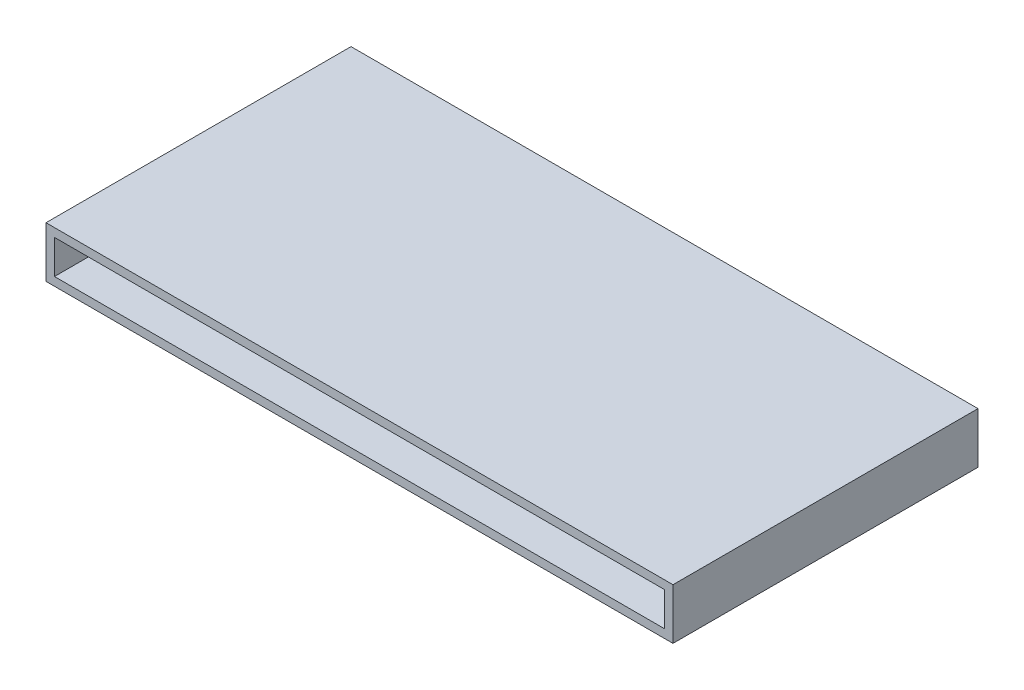
ISO-10303-21;
HEADER;
FILE_DESCRIPTION(('STEP AP214'),'2;1');
FILE_NAME('part.step','',(''),(''),'','','');
FILE_SCHEMA(('AUTOMOTIVE_DESIGN { 1 0 10303 214 1 1 1 1 }'));
ENDSEC;
DATA;
#1=APPLICATION_CONTEXT('core data for automotive mechanical design processes');
#2=APPLICATION_PROTOCOL_DEFINITION('international standard','automotive_design',2000,#1);
#3=PRODUCT_CONTEXT('',#1,'mechanical');
#4=PRODUCT('Part','Part','',(#3));
#5=PRODUCT_RELATED_PRODUCT_CATEGORY('part','',(#4));
#6=PRODUCT_DEFINITION_FORMATION('','',#4);
#7=PRODUCT_DEFINITION_CONTEXT('part definition',#1,'design');
#8=PRODUCT_DEFINITION('design','',#6,#7);
#9=PRODUCT_DEFINITION_SHAPE('','',#8);
#10=(LENGTH_UNIT() NAMED_UNIT(*) SI_UNIT(.MILLI.,.METRE.));
#11=(NAMED_UNIT(*) PLANE_ANGLE_UNIT() SI_UNIT($,.RADIAN.));
#12=(NAMED_UNIT(*) SI_UNIT($,.STERADIAN.) SOLID_ANGLE_UNIT());
#13=UNCERTAINTY_MEASURE_WITH_UNIT(LENGTH_MEASURE(1.E-05),#10,'distance_accuracy_value','');
#14=(GEOMETRIC_REPRESENTATION_CONTEXT(3) GLOBAL_UNCERTAINTY_ASSIGNED_CONTEXT((#13)) GLOBAL_UNIT_ASSIGNED_CONTEXT((#10,
#11,#12)) REPRESENTATION_CONTEXT('',''));
#15=CARTESIAN_POINT('',(0.,0.,0.));
#16=DIRECTION('',(0.,0.,1.));
#17=DIRECTION('',(1.,0.,0.));
#18=AXIS2_PLACEMENT_3D('',#15,#16,#17);
#19=CARTESIAN_POINT('',(0.,0.,72.));
#20=DIRECTION('',(0.,0.,-1.));
#21=DIRECTION('',(-1.,0.,0.));
#22=AXIS2_PLACEMENT_3D('',#19,#20,#21);
#23=PLANE('',#22);
#24=DIRECTION('',(0.,-1.,0.));
#25=VECTOR('',#24,1.);
#26=CARTESIAN_POINT('',(0.,0.,72.));
#27=LINE('',#26,#25);
#28=CARTESIAN_POINT('',(0.,12.,72.));
#29=VERTEX_POINT('',#28);
#30=CARTESIAN_POINT('',(0.,0.,72.));
#31=VERTEX_POINT('',#30);
#32=EDGE_CURVE('E144',#29,#31,#27,.T.);
#33=ORIENTED_EDGE('',*,*,#32,.T.);
#34=DIRECTION('',(1.,0.,0.));
#35=VECTOR('',#34,1.);
#36=CARTESIAN_POINT('',(0.,0.,72.));
#37=LINE('',#36,#35);
#38=CARTESIAN_POINT('',(148.,0.,72.));
#39=VERTEX_POINT('',#38);
#40=EDGE_CURVE('E146',#31,#39,#37,.T.);
#41=ORIENTED_EDGE('',*,*,#40,.T.);
#42=DIRECTION('',(0.,1.,0.));
#43=VECTOR('',#42,1.);
#44=CARTESIAN_POINT('',(148.,0.,72.));
#45=LINE('',#44,#43);
#46=CARTESIAN_POINT('',(148.,12.,72.));
#47=VERTEX_POINT('',#46);
#48=EDGE_CURVE('E151',#39,#47,#45,.T.);
#49=ORIENTED_EDGE('',*,*,#48,.T.);
#50=DIRECTION('',(-1.,0.,0.));
#51=VECTOR('',#50,1.);
#52=CARTESIAN_POINT('',(0.,12.,72.));
#53=LINE('',#52,#51);
#54=EDGE_CURVE('E153',#47,#29,#53,.T.);
#55=ORIENTED_EDGE('',*,*,#54,.T.);
#56=EDGE_LOOP('',(#33,#41,#49,#55));
#57=FACE_BOUND('',#56,.T.);
#58=DIRECTION('',(0.,-1.,0.));
#59=VECTOR('',#58,1.);
#60=CARTESIAN_POINT('',(2.,2.,72.));
#61=LINE('',#60,#59);
#62=CARTESIAN_POINT('',(2.,10.,72.));
#63=VERTEX_POINT('',#62);
#64=CARTESIAN_POINT('',(2.,2.,72.));
#65=VERTEX_POINT('',#64);
#66=EDGE_CURVE('E126',#63,#65,#61,.T.);
#67=ORIENTED_EDGE('',*,*,#66,.F.);
#68=DIRECTION('',(-1.,0.,0.));
#69=VECTOR('',#68,1.);
#70=CARTESIAN_POINT('',(2.,10.,72.));
#71=LINE('',#70,#69);
#72=CARTESIAN_POINT('',(146.,10.,72.));
#73=VERTEX_POINT('',#72);
#74=EDGE_CURVE('E117',#73,#63,#71,.T.);
#75=ORIENTED_EDGE('',*,*,#74,.F.);
#76=DIRECTION('',(0.,1.,0.));
#77=VECTOR('',#76,1.);
#78=CARTESIAN_POINT('',(146.,2.,72.));
#79=LINE('',#78,#77);
#80=CARTESIAN_POINT('',(146.,2.,72.));
#81=VERTEX_POINT('',#80);
#82=EDGE_CURVE('E137',#81,#73,#79,.T.);
#83=ORIENTED_EDGE('',*,*,#82,.F.);
#84=DIRECTION('',(1.,0.,0.));
#85=VECTOR('',#84,1.);
#86=CARTESIAN_POINT('',(2.,2.,72.));
#87=LINE('',#86,#85);
#88=EDGE_CURVE('E128',#65,#81,#87,.T.);
#89=ORIENTED_EDGE('',*,*,#88,.F.);
#90=EDGE_LOOP('',(#67,#75,#83,#89));
#91=FACE_BOUND('',#90,.T.);
#92=ADVANCED_FACE('F43',(#57,#91),#23,.F.);
#93=CARTESIAN_POINT('',(0.,0.,0.));
#94=DIRECTION('',(0.,0.,-1.));
#95=DIRECTION('',(-1.,0.,0.));
#96=AXIS2_PLACEMENT_3D('',#93,#94,#95);
#97=PLANE('',#96);
#98=DIRECTION('',(0.,-1.,0.));
#99=VECTOR('',#98,1.);
#100=CARTESIAN_POINT('',(0.,0.,0.));
#101=LINE('',#100,#99);
#102=CARTESIAN_POINT('',(0.,12.,0.));
#103=VERTEX_POINT('',#102);
#104=CARTESIAN_POINT('',(0.,0.,0.));
#105=VERTEX_POINT('',#104);
#106=EDGE_CURVE('E145',#103,#105,#101,.T.);
#107=ORIENTED_EDGE('',*,*,#106,.F.);
#108=DIRECTION('',(-1.,0.,0.));
#109=VECTOR('',#108,1.);
#110=CARTESIAN_POINT('',(0.,12.,0.));
#111=LINE('',#110,#109);
#112=CARTESIAN_POINT('',(148.,12.,0.));
#113=VERTEX_POINT('',#112);
#114=EDGE_CURVE('E149',#113,#103,#111,.T.);
#115=ORIENTED_EDGE('',*,*,#114,.F.);
#116=DIRECTION('',(0.,1.,0.));
#117=VECTOR('',#116,1.);
#118=CARTESIAN_POINT('',(148.,0.,0.));
#119=LINE('',#118,#117);
#120=CARTESIAN_POINT('',(148.,0.,0.));
#121=VERTEX_POINT('',#120);
#122=EDGE_CURVE('E159',#121,#113,#119,.T.);
#123=ORIENTED_EDGE('',*,*,#122,.F.);
#124=DIRECTION('',(1.,0.,0.));
#125=VECTOR('',#124,1.);
#126=CARTESIAN_POINT('',(0.,0.,0.));
#127=LINE('',#126,#125);
#128=EDGE_CURVE('E158',#105,#121,#127,.T.);
#129=ORIENTED_EDGE('',*,*,#128,.F.);
#130=EDGE_LOOP('',(#107,#115,#123,#129));
#131=FACE_BOUND('',#130,.T.);
#132=ADVANCED_FACE('F180',(#131),#97,.T.);
#133=CARTESIAN_POINT('',(0.,0.,72.));
#134=DIRECTION('',(1.,0.,0.));
#135=DIRECTION('',(0.,0.,-1.));
#136=AXIS2_PLACEMENT_3D('',#133,#134,#135);
#137=PLANE('',#136);
#138=ORIENTED_EDGE('',*,*,#106,.T.);
#139=DIRECTION('',(0.,0.,-1.));
#140=VECTOR('',#139,1.);
#141=CARTESIAN_POINT('',(0.,0.,72.));
#142=LINE('',#141,#140);
#143=EDGE_CURVE('E11',#31,#105,#142,.T.);
#144=ORIENTED_EDGE('',*,*,#143,.F.);
#145=ORIENTED_EDGE('',*,*,#32,.F.);
#146=DIRECTION('',(0.,0.,-1.));
#147=VECTOR('',#146,1.);
#148=CARTESIAN_POINT('',(0.,12.,72.));
#149=LINE('',#148,#147);
#150=EDGE_CURVE('E154',#29,#103,#149,.T.);
#151=ORIENTED_EDGE('',*,*,#150,.T.);
#152=EDGE_LOOP('',(#138,#144,#145,#151));
#153=FACE_BOUND('',#152,.T.);
#154=ADVANCED_FACE('F44',(#153),#137,.F.);
#155=CARTESIAN_POINT('',(0.,0.,72.));
#156=DIRECTION('',(0.,1.,0.));
#157=DIRECTION('',(0.,0.,1.));
#158=AXIS2_PLACEMENT_3D('',#155,#156,#157);
#159=PLANE('',#158);
#160=ORIENTED_EDGE('',*,*,#128,.T.);
#161=DIRECTION('',(0.,0.,-1.));
#162=VECTOR('',#161,1.);
#163=CARTESIAN_POINT('',(148.,0.,72.));
#164=LINE('',#163,#162);
#165=EDGE_CURVE('E51',#39,#121,#164,.T.);
#166=ORIENTED_EDGE('',*,*,#165,.F.);
#167=ORIENTED_EDGE('',*,*,#40,.F.);
#168=ORIENTED_EDGE('',*,*,#143,.T.);
#169=EDGE_LOOP('',(#160,#166,#167,#168));
#170=FACE_BOUND('',#169,.T.);
#171=ADVANCED_FACE('F189',(#170),#159,.F.);
#172=CARTESIAN_POINT('',(148.,0.,72.));
#173=DIRECTION('',(-1.,0.,0.));
#174=DIRECTION('',(0.,0.,1.));
#175=AXIS2_PLACEMENT_3D('',#172,#173,#174);
#176=PLANE('',#175);
#177=ORIENTED_EDGE('',*,*,#122,.T.);
#178=DIRECTION('',(0.,0.,-1.));
#179=VECTOR('',#178,1.);
#180=CARTESIAN_POINT('',(148.,12.,72.));
#181=LINE('',#180,#179);
#182=EDGE_CURVE('E164',#47,#113,#181,.T.);
#183=ORIENTED_EDGE('',*,*,#182,.F.);
#184=ORIENTED_EDGE('',*,*,#48,.F.);
#185=ORIENTED_EDGE('',*,*,#165,.T.);
#186=EDGE_LOOP('',(#177,#183,#184,#185));
#187=FACE_BOUND('',#186,.T.);
#188=ADVANCED_FACE('F175',(#187),#176,.F.);
#189=CARTESIAN_POINT('',(0.,12.,72.));
#190=DIRECTION('',(0.,-1.,0.));
#191=DIRECTION('',(0.,0.,-1.));
#192=AXIS2_PLACEMENT_3D('',#189,#190,#191);
#193=PLANE('',#192);
#194=ORIENTED_EDGE('',*,*,#114,.T.);
#195=ORIENTED_EDGE('',*,*,#150,.F.);
#196=ORIENTED_EDGE('',*,*,#54,.F.);
#197=ORIENTED_EDGE('',*,*,#182,.T.);
#198=EDGE_LOOP('',(#194,#195,#196,#197));
#199=FACE_BOUND('',#198,.T.);
#200=ADVANCED_FACE('F182',(#199),#193,.F.);
#201=CARTESIAN_POINT('',(2.,2.,72.));
#202=DIRECTION('',(1.,0.,0.));
#203=DIRECTION('',(0.,0.,-1.));
#204=AXIS2_PLACEMENT_3D('',#201,#202,#203);
#205=PLANE('',#204);
#206=DIRECTION('',(0.,-1.,0.));
#207=VECTOR('',#206,1.);
#208=CARTESIAN_POINT('',(2.,2.,2.));
#209=LINE('',#208,#207);
#210=CARTESIAN_POINT('',(2.,10.,2.));
#211=VERTEX_POINT('',#210);
#212=CARTESIAN_POINT('',(2.,2.,2.));
#213=VERTEX_POINT('',#212);
#214=EDGE_CURVE('E124',#211,#213,#209,.T.);
#215=ORIENTED_EDGE('',*,*,#214,.F.);
#216=DIRECTION('',(0.,0.,-1.));
#217=VECTOR('',#216,1.);
#218=CARTESIAN_POINT('',(2.,10.,72.));
#219=LINE('',#218,#217);
#220=EDGE_CURVE('E109',#63,#211,#219,.T.);
#221=ORIENTED_EDGE('',*,*,#220,.F.);
#222=ORIENTED_EDGE('',*,*,#66,.T.);
#223=DIRECTION('',(0.,0.,-1.));
#224=VECTOR('',#223,1.);
#225=CARTESIAN_POINT('',(2.,2.,72.));
#226=LINE('',#225,#224);
#227=EDGE_CURVE('E121',#65,#213,#226,.T.);
#228=ORIENTED_EDGE('',*,*,#227,.T.);
#229=EDGE_LOOP('',(#215,#221,#222,#228));
#230=FACE_BOUND('',#229,.T.);
#231=ADVANCED_FACE('F125',(#230),#205,.T.);
#232=CARTESIAN_POINT('',(2.,2.,72.));
#233=DIRECTION('',(0.,1.,0.));
#234=DIRECTION('',(0.,0.,1.));
#235=AXIS2_PLACEMENT_3D('',#232,#233,#234);
#236=PLANE('',#235);
#237=DIRECTION('',(1.,0.,0.));
#238=VECTOR('',#237,1.);
#239=CARTESIAN_POINT('',(2.,2.,2.));
#240=LINE('',#239,#238);
#241=CARTESIAN_POINT('',(146.,2.,2.));
#242=VERTEX_POINT('',#241);
#243=EDGE_CURVE('E59',#213,#242,#240,.T.);
#244=ORIENTED_EDGE('',*,*,#243,.F.);
#245=ORIENTED_EDGE('',*,*,#227,.F.);
#246=ORIENTED_EDGE('',*,*,#88,.T.);
#247=DIRECTION('',(0.,0.,-1.));
#248=VECTOR('',#247,1.);
#249=CARTESIAN_POINT('',(146.,2.,72.));
#250=LINE('',#249,#248);
#251=EDGE_CURVE('E143',#81,#242,#250,.T.);
#252=ORIENTED_EDGE('',*,*,#251,.T.);
#253=EDGE_LOOP('',(#244,#245,#246,#252));
#254=FACE_BOUND('',#253,.T.);
#255=ADVANCED_FACE('F208',(#254),#236,.T.);
#256=CARTESIAN_POINT('',(146.,2.,72.));
#257=DIRECTION('',(-1.,0.,0.));
#258=DIRECTION('',(0.,0.,1.));
#259=AXIS2_PLACEMENT_3D('',#256,#257,#258);
#260=PLANE('',#259);
#261=DIRECTION('',(0.,1.,0.));
#262=VECTOR('',#261,1.);
#263=CARTESIAN_POINT('',(146.,2.,2.));
#264=LINE('',#263,#262);
#265=CARTESIAN_POINT('',(146.,10.,2.));
#266=VERTEX_POINT('',#265);
#267=EDGE_CURVE('E67',#242,#266,#264,.T.);
#268=ORIENTED_EDGE('',*,*,#267,.F.);
#269=ORIENTED_EDGE('',*,*,#251,.F.);
#270=ORIENTED_EDGE('',*,*,#82,.T.);
#271=DIRECTION('',(0.,0.,-1.));
#272=VECTOR('',#271,1.);
#273=CARTESIAN_POINT('',(146.,10.,72.));
#274=LINE('',#273,#272);
#275=EDGE_CURVE('E116',#73,#266,#274,.T.);
#276=ORIENTED_EDGE('',*,*,#275,.T.);
#277=EDGE_LOOP('',(#268,#269,#270,#276));
#278=FACE_BOUND('',#277,.T.);
#279=ADVANCED_FACE('F215',(#278),#260,.T.);
#280=CARTESIAN_POINT('',(2.,10.,72.));
#281=DIRECTION('',(0.,-1.,0.));
#282=DIRECTION('',(0.,0.,-1.));
#283=AXIS2_PLACEMENT_3D('',#280,#281,#282);
#284=PLANE('',#283);
#285=DIRECTION('',(-1.,0.,0.));
#286=VECTOR('',#285,1.);
#287=CARTESIAN_POINT('',(2.,10.,2.));
#288=LINE('',#287,#286);
#289=EDGE_CURVE('E111',#266,#211,#288,.T.);
#290=ORIENTED_EDGE('',*,*,#289,.F.);
#291=ORIENTED_EDGE('',*,*,#275,.F.);
#292=ORIENTED_EDGE('',*,*,#74,.T.);
#293=ORIENTED_EDGE('',*,*,#220,.T.);
#294=EDGE_LOOP('',(#290,#291,#292,#293));
#295=FACE_BOUND('',#294,.T.);
#296=ADVANCED_FACE('F115',(#295),#284,.T.);
#297=CARTESIAN_POINT('',(0.,0.,2.));
#298=DIRECTION('',(0.,0.,-1.));
#299=DIRECTION('',(-1.,0.,0.));
#300=AXIS2_PLACEMENT_3D('',#297,#298,#299);
#301=PLANE('',#300);
#302=ORIENTED_EDGE('',*,*,#214,.T.);
#303=ORIENTED_EDGE('',*,*,#243,.T.);
#304=ORIENTED_EDGE('',*,*,#267,.T.);
#305=ORIENTED_EDGE('',*,*,#289,.T.);
#306=EDGE_LOOP('',(#302,#303,#304,#305));
#307=FACE_BOUND('',#306,.T.);
#308=ADVANCED_FACE('F130',(#307),#301,.F.);
#309=CLOSED_SHELL('',(#92,#132,#154,#171,#188,#200,#231,#255,#279,#296,#308));
#310=MANIFOLD_SOLID_BREP('B2',#309);
#311=ADVANCED_BREP_SHAPE_REPRESENTATION('',(#18,#310),#14);
#312=SHAPE_DEFINITION_REPRESENTATION(#9,#311);
ENDSEC;
END-ISO-10303-21;
